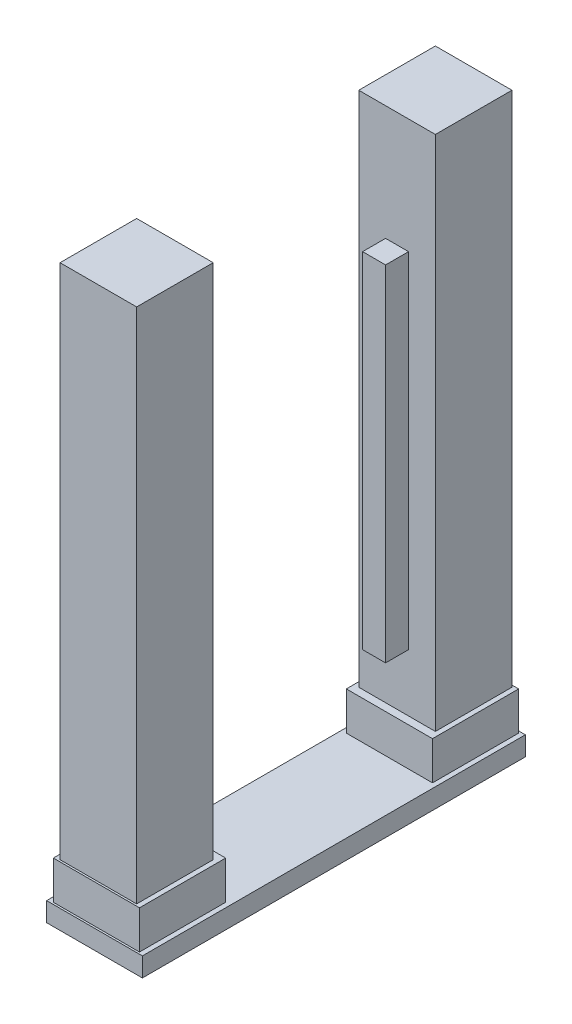
ISO-10303-21;
HEADER;
FILE_DESCRIPTION(('STEP AP214'),'2;1');
FILE_NAME('part.step','',(''),(''),'','','');
FILE_SCHEMA(('AUTOMOTIVE_DESIGN { 1 0 10303 214 1 1 1 1 }'));
ENDSEC;
DATA;
#1=APPLICATION_CONTEXT('core data for automotive mechanical design processes');
#2=APPLICATION_PROTOCOL_DEFINITION('international standard','automotive_design',2000,#1);
#3=PRODUCT_CONTEXT('',#1,'mechanical');
#4=PRODUCT('Part','Part','',(#3));
#5=PRODUCT_RELATED_PRODUCT_CATEGORY('part','',(#4));
#6=PRODUCT_DEFINITION_FORMATION('','',#4);
#7=PRODUCT_DEFINITION_CONTEXT('part definition',#1,'design');
#8=PRODUCT_DEFINITION('design','',#6,#7);
#9=PRODUCT_DEFINITION_SHAPE('','',#8);
#10=(LENGTH_UNIT() NAMED_UNIT(*) SI_UNIT(.MILLI.,.METRE.));
#11=(NAMED_UNIT(*) PLANE_ANGLE_UNIT() SI_UNIT($,.RADIAN.));
#12=(NAMED_UNIT(*) SI_UNIT($,.STERADIAN.) SOLID_ANGLE_UNIT());
#13=UNCERTAINTY_MEASURE_WITH_UNIT(LENGTH_MEASURE(1.E-05),#10,'distance_accuracy_value','');
#14=(GEOMETRIC_REPRESENTATION_CONTEXT(3) GLOBAL_UNCERTAINTY_ASSIGNED_CONTEXT((#13)) GLOBAL_UNIT_ASSIGNED_CONTEXT((#10,
#11,#12)) REPRESENTATION_CONTEXT('',''));
#15=CARTESIAN_POINT('',(0.,0.,0.));
#16=DIRECTION('',(0.,0.,1.));
#17=DIRECTION('',(1.,0.,0.));
#18=AXIS2_PLACEMENT_3D('',#15,#16,#17);
#19=CARTESIAN_POINT('',(-6.,13.0294372515229,58.));
#20=DIRECTION('',(0.,0.,1.));
#21=DIRECTION('',(1.,0.,0.));
#22=AXIS2_PLACEMENT_3D('',#19,#20,#21);
#23=PLANE('',#22);
#24=DIRECTION('',(-1.,0.,0.));
#25=VECTOR('',#24,1.);
#26=CARTESIAN_POINT('',(-6.,60.,58.));
#27=LINE('',#26,#25);
#28=CARTESIAN_POINT('',(6.,60.,58.));
#29=VERTEX_POINT('',#28);
#30=CARTESIAN_POINT('',(-6.,60.,58.));
#31=VERTEX_POINT('',#30);
#32=EDGE_CURVE('E57',#29,#31,#27,.T.);
#33=ORIENTED_EDGE('',*,*,#32,.F.);
#34=DIRECTION('',(0.,1.,0.));
#35=VECTOR('',#34,1.);
#36=CARTESIAN_POINT('',(6.,13.0294372515229,58.));
#37=LINE('',#36,#35);
#38=CARTESIAN_POINT('',(6.,240.,58.));
#39=VERTEX_POINT('',#38);
#40=EDGE_CURVE('E85',#29,#39,#37,.T.);
#41=ORIENTED_EDGE('',*,*,#40,.T.);
#42=DIRECTION('',(1.,0.,0.));
#43=VECTOR('',#42,1.);
#44=CARTESIAN_POINT('',(-6.,240.,58.));
#45=LINE('',#44,#43);
#46=CARTESIAN_POINT('',(-6.,240.,58.));
#47=VERTEX_POINT('',#46);
#48=EDGE_CURVE('E89',#47,#39,#45,.T.);
#49=ORIENTED_EDGE('',*,*,#48,.F.);
#50=DIRECTION('',(0.,1.,0.));
#51=VECTOR('',#50,1.);
#52=CARTESIAN_POINT('',(-6.,13.0294372515229,58.));
#53=LINE('',#52,#51);
#54=EDGE_CURVE('E112',#31,#47,#53,.T.);
#55=ORIENTED_EDGE('',*,*,#54,.F.);
#56=EDGE_LOOP('',(#33,#41,#49,#55));
#57=FACE_BOUND('',#56,.T.);
#58=ADVANCED_FACE('F49',(#57),#23,.T.);
#59=CARTESIAN_POINT('',(-6.,13.0294372515229,58.));
#60=DIRECTION('',(-1.,0.,0.));
#61=DIRECTION('',(0.,0.,1.));
#62=AXIS2_PLACEMENT_3D('',#59,#60,#61);
#63=PLANE('',#62);
#64=DIRECTION('',(0.,0.,-1.));
#65=VECTOR('',#64,1.);
#66=CARTESIAN_POINT('',(-6.,60.,58.));
#67=LINE('',#66,#65);
#68=CARTESIAN_POINT('',(-6.,60.,46.));
#69=VERTEX_POINT('',#68);
#70=EDGE_CURVE('E63',#31,#69,#67,.T.);
#71=ORIENTED_EDGE('',*,*,#70,.F.);
#72=ORIENTED_EDGE('',*,*,#54,.T.);
#73=DIRECTION('',(0.,0.,1.));
#74=VECTOR('',#73,1.);
#75=CARTESIAN_POINT('',(-6.,240.,58.));
#76=LINE('',#75,#74);
#77=CARTESIAN_POINT('',(-6.,240.,46.));
#78=VERTEX_POINT('',#77);
#79=EDGE_CURVE('E94',#78,#47,#76,.T.);
#80=ORIENTED_EDGE('',*,*,#79,.F.);
#81=DIRECTION('',(0.,1.,0.));
#82=VECTOR('',#81,1.);
#83=CARTESIAN_POINT('',(-6.,13.0294372515229,46.));
#84=LINE('',#83,#82);
#85=EDGE_CURVE('E115',#69,#78,#84,.T.);
#86=ORIENTED_EDGE('',*,*,#85,.F.);
#87=EDGE_LOOP('',(#71,#72,#80,#86));
#88=FACE_BOUND('',#87,.T.);
#89=ADVANCED_FACE('F121',(#88),#63,.T.);
#90=CARTESIAN_POINT('',(-6.,13.0294372515229,46.));
#91=DIRECTION('',(0.,0.,-1.));
#92=DIRECTION('',(-1.,0.,0.));
#93=AXIS2_PLACEMENT_3D('',#90,#91,#92);
#94=PLANE('',#93);
#95=DIRECTION('',(1.,0.,0.));
#96=VECTOR('',#95,1.);
#97=CARTESIAN_POINT('',(-6.,60.,46.));
#98=LINE('',#97,#96);
#99=CARTESIAN_POINT('',(6.,60.,46.));
#100=VERTEX_POINT('',#99);
#101=EDGE_CURVE('E114',#69,#100,#98,.T.);
#102=ORIENTED_EDGE('',*,*,#101,.F.);
#103=ORIENTED_EDGE('',*,*,#85,.T.);
#104=DIRECTION('',(-1.,0.,0.));
#105=VECTOR('',#104,1.);
#106=CARTESIAN_POINT('',(-6.,240.,46.));
#107=LINE('',#106,#105);
#108=CARTESIAN_POINT('',(6.,240.,46.));
#109=VERTEX_POINT('',#108);
#110=EDGE_CURVE('E102',#109,#78,#107,.T.);
#111=ORIENTED_EDGE('',*,*,#110,.F.);
#112=DIRECTION('',(0.,1.,0.));
#113=VECTOR('',#112,1.);
#114=CARTESIAN_POINT('',(6.,13.0294372515229,46.));
#115=LINE('',#114,#113);
#116=EDGE_CURVE('E93',#100,#109,#115,.T.);
#117=ORIENTED_EDGE('',*,*,#116,.F.);
#118=EDGE_LOOP('',(#102,#103,#111,#117));
#119=FACE_BOUND('',#118,.T.);
#120=ADVANCED_FACE('F119',(#119),#94,.T.);
#121=CARTESIAN_POINT('',(6.,13.0294372515229,58.));
#122=DIRECTION('',(1.,0.,0.));
#123=DIRECTION('',(0.,0.,-1.));
#124=AXIS2_PLACEMENT_3D('',#121,#122,#123);
#125=PLANE('',#124);
#126=DIRECTION('',(0.,0.,1.));
#127=VECTOR('',#126,1.);
#128=CARTESIAN_POINT('',(6.,60.,58.));
#129=LINE('',#128,#127);
#130=EDGE_CURVE('E13',#100,#29,#129,.T.);
#131=ORIENTED_EDGE('',*,*,#130,.F.);
#132=ORIENTED_EDGE('',*,*,#116,.T.);
#133=DIRECTION('',(0.,0.,-1.));
#134=VECTOR('',#133,1.);
#135=CARTESIAN_POINT('',(6.,240.,58.));
#136=LINE('',#135,#134);
#137=EDGE_CURVE('E96',#39,#109,#136,.T.);
#138=ORIENTED_EDGE('',*,*,#137,.F.);
#139=ORIENTED_EDGE('',*,*,#40,.F.);
#140=EDGE_LOOP('',(#131,#132,#138,#139));
#141=FACE_BOUND('',#140,.T.);
#142=ADVANCED_FACE('F97',(#141),#125,.T.);
#143=CARTESIAN_POINT('',(0.,240.,0.));
#144=DIRECTION('',(0.,1.,0.));
#145=DIRECTION('',(0.,0.,1.));
#146=AXIS2_PLACEMENT_3D('',#143,#144,#145);
#147=PLANE('',#146);
#148=ORIENTED_EDGE('',*,*,#48,.T.);
#149=ORIENTED_EDGE('',*,*,#137,.T.);
#150=ORIENTED_EDGE('',*,*,#110,.T.);
#151=ORIENTED_EDGE('',*,*,#79,.T.);
#152=EDGE_LOOP('',(#148,#149,#150,#151));
#153=FACE_BOUND('',#152,.T.);
#154=ADVANCED_FACE('F104',(#153),#147,.T.);
#155=CARTESIAN_POINT('',(0.,60.,0.));
#156=DIRECTION('',(0.,1.,0.));
#157=DIRECTION('',(0.,0.,1.));
#158=AXIS2_PLACEMENT_3D('',#155,#156,#157);
#159=PLANE('',#158);
#160=ORIENTED_EDGE('',*,*,#32,.T.);
#161=ORIENTED_EDGE('',*,*,#70,.T.);
#162=ORIENTED_EDGE('',*,*,#101,.T.);
#163=ORIENTED_EDGE('',*,*,#130,.T.);
#164=EDGE_LOOP('',(#160,#161,#162,#163));
#165=FACE_BOUND('',#164,.T.);
#166=ADVANCED_FACE('F123',(#165),#159,.F.);
#167=CLOSED_SHELL('',(#58,#89,#120,#142,#154,#166));
#168=MANIFOLD_SOLID_BREP('B2',#167);
#169=CARTESIAN_POINT('',(-6.,13.0294372515229,-58.));
#170=DIRECTION('',(-1.,0.,0.));
#171=DIRECTION('',(0.,0.,1.));
#172=AXIS2_PLACEMENT_3D('',#169,#170,#171);
#173=PLANE('',#172);
#174=DIRECTION('',(0.,0.,-1.));
#175=VECTOR('',#174,1.);
#176=CARTESIAN_POINT('',(-6.,60.,-58.));
#177=LINE('',#176,#175);
#178=CARTESIAN_POINT('',(-6.,60.,-46.));
#179=VERTEX_POINT('',#178);
#180=CARTESIAN_POINT('',(-6.,60.,-58.));
#181=VERTEX_POINT('',#180);
#182=EDGE_CURVE('E191',#179,#181,#177,.T.);
#183=ORIENTED_EDGE('',*,*,#182,.F.);
#184=DIRECTION('',(0.,1.,0.));
#185=VECTOR('',#184,1.);
#186=CARTESIAN_POINT('',(-6.,13.0294372515229,-46.));
#187=LINE('',#186,#185);
#188=CARTESIAN_POINT('',(-6.,240.,-46.));
#189=VERTEX_POINT('',#188);
#190=EDGE_CURVE('E219',#179,#189,#187,.T.);
#191=ORIENTED_EDGE('',*,*,#190,.T.);
#192=DIRECTION('',(0.,0.,1.));
#193=VECTOR('',#192,1.);
#194=CARTESIAN_POINT('',(-6.,240.,-58.));
#195=LINE('',#194,#193);
#196=CARTESIAN_POINT('',(-6.,240.,-58.));
#197=VERTEX_POINT('',#196);
#198=EDGE_CURVE('E223',#197,#189,#195,.T.);
#199=ORIENTED_EDGE('',*,*,#198,.F.);
#200=DIRECTION('',(0.,1.,0.));
#201=VECTOR('',#200,1.);
#202=CARTESIAN_POINT('',(-6.,13.0294372515229,-58.));
#203=LINE('',#202,#201);
#204=EDGE_CURVE('E246',#181,#197,#203,.T.);
#205=ORIENTED_EDGE('',*,*,#204,.F.);
#206=EDGE_LOOP('',(#183,#191,#199,#205));
#207=FACE_BOUND('',#206,.T.);
#208=ADVANCED_FACE('F183',(#207),#173,.T.);
#209=CARTESIAN_POINT('',(-6.,13.0294372515229,-58.));
#210=DIRECTION('',(0.,0.,-1.));
#211=DIRECTION('',(-1.,0.,0.));
#212=AXIS2_PLACEMENT_3D('',#209,#210,#211);
#213=PLANE('',#212);
#214=DIRECTION('',(1.,0.,0.));
#215=VECTOR('',#214,1.);
#216=CARTESIAN_POINT('',(-6.,60.,-58.));
#217=LINE('',#216,#215);
#218=CARTESIAN_POINT('',(6.,60.,-58.));
#219=VERTEX_POINT('',#218);
#220=EDGE_CURVE('E197',#181,#219,#217,.T.);
#221=ORIENTED_EDGE('',*,*,#220,.F.);
#222=ORIENTED_EDGE('',*,*,#204,.T.);
#223=DIRECTION('',(-1.,0.,0.));
#224=VECTOR('',#223,1.);
#225=CARTESIAN_POINT('',(-6.,240.,-58.));
#226=LINE('',#225,#224);
#227=CARTESIAN_POINT('',(6.,240.,-58.));
#228=VERTEX_POINT('',#227);
#229=EDGE_CURVE('E228',#228,#197,#226,.T.);
#230=ORIENTED_EDGE('',*,*,#229,.F.);
#231=DIRECTION('',(0.,1.,0.));
#232=VECTOR('',#231,1.);
#233=CARTESIAN_POINT('',(6.,13.0294372515229,-58.));
#234=LINE('',#233,#232);
#235=EDGE_CURVE('E249',#219,#228,#234,.T.);
#236=ORIENTED_EDGE('',*,*,#235,.F.);
#237=EDGE_LOOP('',(#221,#222,#230,#236));
#238=FACE_BOUND('',#237,.T.);
#239=ADVANCED_FACE('F255',(#238),#213,.T.);
#240=CARTESIAN_POINT('',(6.,13.0294372515229,-58.));
#241=DIRECTION('',(1.,0.,0.));
#242=DIRECTION('',(0.,0.,-1.));
#243=AXIS2_PLACEMENT_3D('',#240,#241,#242);
#244=PLANE('',#243);
#245=DIRECTION('',(0.,0.,1.));
#246=VECTOR('',#245,1.);
#247=CARTESIAN_POINT('',(6.,60.,-58.));
#248=LINE('',#247,#246);
#249=CARTESIAN_POINT('',(6.,60.,-46.));
#250=VERTEX_POINT('',#249);
#251=EDGE_CURVE('E248',#219,#250,#248,.T.);
#252=ORIENTED_EDGE('',*,*,#251,.F.);
#253=ORIENTED_EDGE('',*,*,#235,.T.);
#254=DIRECTION('',(0.,0.,-1.));
#255=VECTOR('',#254,1.);
#256=CARTESIAN_POINT('',(6.,240.,-58.));
#257=LINE('',#256,#255);
#258=CARTESIAN_POINT('',(6.,240.,-46.));
#259=VERTEX_POINT('',#258);
#260=EDGE_CURVE('E236',#259,#228,#257,.T.);
#261=ORIENTED_EDGE('',*,*,#260,.F.);
#262=DIRECTION('',(0.,1.,0.));
#263=VECTOR('',#262,1.);
#264=CARTESIAN_POINT('',(6.,13.0294372515229,-46.));
#265=LINE('',#264,#263);
#266=EDGE_CURVE('E227',#250,#259,#265,.T.);
#267=ORIENTED_EDGE('',*,*,#266,.F.);
#268=EDGE_LOOP('',(#252,#253,#261,#267));
#269=FACE_BOUND('',#268,.T.);
#270=ADVANCED_FACE('F253',(#269),#244,.T.);
#271=CARTESIAN_POINT('',(-6.,13.0294372515229,-46.));
#272=DIRECTION('',(0.,0.,1.));
#273=DIRECTION('',(1.,0.,0.));
#274=AXIS2_PLACEMENT_3D('',#271,#272,#273);
#275=PLANE('',#274);
#276=DIRECTION('',(-1.,0.,0.));
#277=VECTOR('',#276,1.);
#278=CARTESIAN_POINT('',(-6.,60.,-46.));
#279=LINE('',#278,#277);
#280=EDGE_CURVE('E47',#250,#179,#279,.T.);
#281=ORIENTED_EDGE('',*,*,#280,.F.);
#282=ORIENTED_EDGE('',*,*,#266,.T.);
#283=DIRECTION('',(1.,0.,0.));
#284=VECTOR('',#283,1.);
#285=CARTESIAN_POINT('',(-6.,240.,-46.));
#286=LINE('',#285,#284);
#287=EDGE_CURVE('E230',#189,#259,#286,.T.);
#288=ORIENTED_EDGE('',*,*,#287,.F.);
#289=ORIENTED_EDGE('',*,*,#190,.F.);
#290=EDGE_LOOP('',(#281,#282,#288,#289));
#291=FACE_BOUND('',#290,.T.);
#292=ADVANCED_FACE('F231',(#291),#275,.T.);
#293=CARTESIAN_POINT('',(0.,240.,0.));
#294=DIRECTION('',(0.,1.,0.));
#295=DIRECTION('',(0.,0.,1.));
#296=AXIS2_PLACEMENT_3D('',#293,#294,#295);
#297=PLANE('',#296);
#298=ORIENTED_EDGE('',*,*,#198,.T.);
#299=ORIENTED_EDGE('',*,*,#287,.T.);
#300=ORIENTED_EDGE('',*,*,#260,.T.);
#301=ORIENTED_EDGE('',*,*,#229,.T.);
#302=EDGE_LOOP('',(#298,#299,#300,#301));
#303=FACE_BOUND('',#302,.T.);
#304=ADVANCED_FACE('F238',(#303),#297,.T.);
#305=CARTESIAN_POINT('',(0.,60.,0.));
#306=DIRECTION('',(0.,1.,0.));
#307=DIRECTION('',(0.,0.,1.));
#308=AXIS2_PLACEMENT_3D('',#305,#306,#307);
#309=PLANE('',#308);
#310=ORIENTED_EDGE('',*,*,#182,.T.);
#311=ORIENTED_EDGE('',*,*,#220,.T.);
#312=ORIENTED_EDGE('',*,*,#251,.T.);
#313=ORIENTED_EDGE('',*,*,#280,.T.);
#314=EDGE_LOOP('',(#310,#311,#312,#313));
#315=FACE_BOUND('',#314,.T.);
#316=ADVANCED_FACE('F257',(#315),#309,.F.);
#317=CLOSED_SHELL('',(#208,#239,#270,#292,#304,#316));
#318=MANIFOLD_SOLID_BREP('B7',#317);
#319=CARTESIAN_POINT('',(-20.,300.,98.));
#320=DIRECTION('',(0.,0.,-1.));
#321=DIRECTION('',(-1.,0.,0.));
#322=AXIS2_PLACEMENT_3D('',#319,#320,#321);
#323=PLANE('',#322);
#324=DIRECTION('',(1.,0.,0.));
#325=VECTOR('',#324,1.);
#326=CARTESIAN_POINT('',(-20.,30.,98.));
#327=LINE('',#326,#325);
#328=CARTESIAN_POINT('',(-20.,30.,98.));
#329=VERTEX_POINT('',#328);
#330=CARTESIAN_POINT('',(20.,30.,98.));
#331=VERTEX_POINT('',#330);
#332=EDGE_CURVE('E380',#329,#331,#327,.T.);
#333=ORIENTED_EDGE('',*,*,#332,.T.);
#334=DIRECTION('',(0.,-1.,0.));
#335=VECTOR('',#334,1.);
#336=CARTESIAN_POINT('',(20.,300.,98.));
#337=LINE('',#336,#335);
#338=CARTESIAN_POINT('',(20.,300.,98.));
#339=VERTEX_POINT('',#338);
#340=EDGE_CURVE('E181',#339,#331,#337,.T.);
#341=ORIENTED_EDGE('',*,*,#340,.F.);
#342=DIRECTION('',(1.,0.,0.));
#343=VECTOR('',#342,1.);
#344=CARTESIAN_POINT('',(-20.,300.,98.));
#345=LINE('',#344,#343);
#346=CARTESIAN_POINT('',(-20.,300.,98.));
#347=VERTEX_POINT('',#346);
#348=EDGE_CURVE('E368',#347,#339,#345,.T.);
#349=ORIENTED_EDGE('',*,*,#348,.F.);
#350=DIRECTION('',(0.,-1.,0.));
#351=VECTOR('',#350,1.);
#352=CARTESIAN_POINT('',(-20.,300.,98.));
#353=LINE('',#352,#351);
#354=EDGE_CURVE('E376',#347,#329,#353,.T.);
#355=ORIENTED_EDGE('',*,*,#354,.T.);
#356=EDGE_LOOP('',(#333,#341,#349,#355));
#357=FACE_BOUND('',#356,.T.);
#358=ADVANCED_FACE('F317',(#357),#323,.F.);
#359=CARTESIAN_POINT('',(20.,300.,98.));
#360=DIRECTION('',(-1.,0.,0.));
#361=DIRECTION('',(0.,0.,1.));
#362=AXIS2_PLACEMENT_3D('',#359,#360,#361);
#363=PLANE('',#362);
#364=DIRECTION('',(0.,0.,-1.));
#365=VECTOR('',#364,1.);
#366=CARTESIAN_POINT('',(20.,30.,98.));
#367=LINE('',#366,#365);
#368=CARTESIAN_POINT('',(20.,30.,58.));
#369=VERTEX_POINT('',#368);
#370=EDGE_CURVE('E372',#331,#369,#367,.T.);
#371=ORIENTED_EDGE('',*,*,#370,.T.);
#372=DIRECTION('',(0.,-1.,0.));
#373=VECTOR('',#372,1.);
#374=CARTESIAN_POINT('',(20.,300.,58.));
#375=LINE('',#374,#373);
#376=CARTESIAN_POINT('',(20.,300.,58.));
#377=VERTEX_POINT('',#376);
#378=EDGE_CURVE('E325',#377,#369,#375,.T.);
#379=ORIENTED_EDGE('',*,*,#378,.F.);
#380=DIRECTION('',(0.,0.,-1.));
#381=VECTOR('',#380,1.);
#382=CARTESIAN_POINT('',(20.,300.,98.));
#383=LINE('',#382,#381);
#384=EDGE_CURVE('E363',#339,#377,#383,.T.);
#385=ORIENTED_EDGE('',*,*,#384,.F.);
#386=ORIENTED_EDGE('',*,*,#340,.T.);
#387=EDGE_LOOP('',(#371,#379,#385,#386));
#388=FACE_BOUND('',#387,.T.);
#389=ADVANCED_FACE('F371',(#388),#363,.F.);
#390=CARTESIAN_POINT('',(-20.,300.,58.));
#391=DIRECTION('',(0.,0.,1.));
#392=DIRECTION('',(1.,0.,0.));
#393=AXIS2_PLACEMENT_3D('',#390,#391,#392);
#394=PLANE('',#393);
#395=DIRECTION('',(-1.,0.,0.));
#396=VECTOR('',#395,1.);
#397=CARTESIAN_POINT('',(-20.,30.,58.));
#398=LINE('',#397,#396);
#399=CARTESIAN_POINT('',(-20.,30.,58.));
#400=VERTEX_POINT('',#399);
#401=EDGE_CURVE('E350',#369,#400,#398,.T.);
#402=ORIENTED_EDGE('',*,*,#401,.T.);
#403=DIRECTION('',(0.,-1.,0.));
#404=VECTOR('',#403,1.);
#405=CARTESIAN_POINT('',(-20.,300.,58.));
#406=LINE('',#405,#404);
#407=CARTESIAN_POINT('',(-20.,300.,58.));
#408=VERTEX_POINT('',#407);
#409=EDGE_CURVE('E373',#408,#400,#406,.T.);
#410=ORIENTED_EDGE('',*,*,#409,.F.);
#411=DIRECTION('',(-1.,0.,0.));
#412=VECTOR('',#411,1.);
#413=CARTESIAN_POINT('',(-20.,300.,58.));
#414=LINE('',#413,#412);
#415=EDGE_CURVE('E366',#377,#408,#414,.T.);
#416=ORIENTED_EDGE('',*,*,#415,.F.);
#417=ORIENTED_EDGE('',*,*,#378,.T.);
#418=EDGE_LOOP('',(#402,#410,#416,#417));
#419=FACE_BOUND('',#418,.T.);
#420=ADVANCED_FACE('F374',(#419),#394,.F.);
#421=CARTESIAN_POINT('',(-20.,300.,98.));
#422=DIRECTION('',(1.,0.,0.));
#423=DIRECTION('',(0.,0.,-1.));
#424=AXIS2_PLACEMENT_3D('',#421,#422,#423);
#425=PLANE('',#424);
#426=DIRECTION('',(0.,0.,1.));
#427=VECTOR('',#426,1.);
#428=CARTESIAN_POINT('',(-20.,30.,98.));
#429=LINE('',#428,#427);
#430=EDGE_CURVE('E356',#400,#329,#429,.T.);
#431=ORIENTED_EDGE('',*,*,#430,.T.);
#432=ORIENTED_EDGE('',*,*,#354,.F.);
#433=DIRECTION('',(0.,0.,1.));
#434=VECTOR('',#433,1.);
#435=CARTESIAN_POINT('',(-20.,300.,98.));
#436=LINE('',#435,#434);
#437=EDGE_CURVE('E333',#408,#347,#436,.T.);
#438=ORIENTED_EDGE('',*,*,#437,.F.);
#439=ORIENTED_EDGE('',*,*,#409,.T.);
#440=EDGE_LOOP('',(#431,#432,#438,#439));
#441=FACE_BOUND('',#440,.T.);
#442=ADVANCED_FACE('F387',(#441),#425,.F.);
#443=CARTESIAN_POINT('',(0.,300.,0.));
#444=DIRECTION('',(0.,1.,0.));
#445=DIRECTION('',(0.,0.,1.));
#446=AXIS2_PLACEMENT_3D('',#443,#444,#445);
#447=PLANE('',#446);
#448=ORIENTED_EDGE('',*,*,#348,.T.);
#449=ORIENTED_EDGE('',*,*,#384,.T.);
#450=ORIENTED_EDGE('',*,*,#415,.T.);
#451=ORIENTED_EDGE('',*,*,#437,.T.);
#452=EDGE_LOOP('',(#448,#449,#450,#451));
#453=FACE_BOUND('',#452,.T.);
#454=ADVANCED_FACE('F364',(#453),#447,.T.);
#455=CARTESIAN_POINT('',(0.,30.,0.));
#456=DIRECTION('',(0.,1.,0.));
#457=DIRECTION('',(0.,0.,1.));
#458=AXIS2_PLACEMENT_3D('',#455,#456,#457);
#459=PLANE('',#458);
#460=ORIENTED_EDGE('',*,*,#332,.F.);
#461=ORIENTED_EDGE('',*,*,#430,.F.);
#462=ORIENTED_EDGE('',*,*,#401,.F.);
#463=ORIENTED_EDGE('',*,*,#370,.F.);
#464=EDGE_LOOP('',(#460,#461,#462,#463));
#465=FACE_BOUND('',#464,.T.);
#466=ADVANCED_FACE('F390',(#465),#459,.F.);
#467=CLOSED_SHELL('',(#358,#389,#420,#442,#454,#466));
#468=MANIFOLD_SOLID_BREP('B41',#467);
#469=CARTESIAN_POINT('',(-20.,300.,-98.));
#470=DIRECTION('',(1.,0.,0.));
#471=DIRECTION('',(0.,0.,-1.));
#472=AXIS2_PLACEMENT_3D('',#469,#470,#471);
#473=PLANE('',#472);
#474=DIRECTION('',(0.,0.,1.));
#475=VECTOR('',#474,1.);
#476=CARTESIAN_POINT('',(-20.,30.,-98.));
#477=LINE('',#476,#475);
#478=CARTESIAN_POINT('',(-20.,30.,-98.));
#479=VERTEX_POINT('',#478);
#480=CARTESIAN_POINT('',(-20.,30.,-58.));
#481=VERTEX_POINT('',#480);
#482=EDGE_CURVE('E514',#479,#481,#477,.T.);
#483=ORIENTED_EDGE('',*,*,#482,.T.);
#484=DIRECTION('',(0.,-1.,0.));
#485=VECTOR('',#484,1.);
#486=CARTESIAN_POINT('',(-20.,300.,-58.));
#487=LINE('',#486,#485);
#488=CARTESIAN_POINT('',(-20.,300.,-58.));
#489=VERTEX_POINT('',#488);
#490=EDGE_CURVE('E315',#489,#481,#487,.T.);
#491=ORIENTED_EDGE('',*,*,#490,.F.);
#492=DIRECTION('',(0.,0.,1.));
#493=VECTOR('',#492,1.);
#494=CARTESIAN_POINT('',(-20.,300.,-98.));
#495=LINE('',#494,#493);
#496=CARTESIAN_POINT('',(-20.,300.,-98.));
#497=VERTEX_POINT('',#496);
#498=EDGE_CURVE('E502',#497,#489,#495,.T.);
#499=ORIENTED_EDGE('',*,*,#498,.F.);
#500=DIRECTION('',(0.,-1.,0.));
#501=VECTOR('',#500,1.);
#502=CARTESIAN_POINT('',(-20.,300.,-98.));
#503=LINE('',#502,#501);
#504=EDGE_CURVE('E510',#497,#479,#503,.T.);
#505=ORIENTED_EDGE('',*,*,#504,.T.);
#506=EDGE_LOOP('',(#483,#491,#499,#505));
#507=FACE_BOUND('',#506,.T.);
#508=ADVANCED_FACE('F451',(#507),#473,.F.);
#509=CARTESIAN_POINT('',(-20.,300.,-58.));
#510=DIRECTION('',(0.,0.,-1.));
#511=DIRECTION('',(-1.,0.,0.));
#512=AXIS2_PLACEMENT_3D('',#509,#510,#511);
#513=PLANE('',#512);
#514=DIRECTION('',(1.,0.,0.));
#515=VECTOR('',#514,1.);
#516=CARTESIAN_POINT('',(-20.,30.,-58.));
#517=LINE('',#516,#515);
#518=CARTESIAN_POINT('',(20.,30.,-58.));
#519=VERTEX_POINT('',#518);
#520=EDGE_CURVE('E506',#481,#519,#517,.T.);
#521=ORIENTED_EDGE('',*,*,#520,.T.);
#522=DIRECTION('',(0.,-1.,0.));
#523=VECTOR('',#522,1.);
#524=CARTESIAN_POINT('',(20.,300.,-58.));
#525=LINE('',#524,#523);
#526=CARTESIAN_POINT('',(20.,300.,-58.));
#527=VERTEX_POINT('',#526);
#528=EDGE_CURVE('E459',#527,#519,#525,.T.);
#529=ORIENTED_EDGE('',*,*,#528,.F.);
#530=DIRECTION('',(1.,0.,0.));
#531=VECTOR('',#530,1.);
#532=CARTESIAN_POINT('',(-20.,300.,-58.));
#533=LINE('',#532,#531);
#534=EDGE_CURVE('E497',#489,#527,#533,.T.);
#535=ORIENTED_EDGE('',*,*,#534,.F.);
#536=ORIENTED_EDGE('',*,*,#490,.T.);
#537=EDGE_LOOP('',(#521,#529,#535,#536));
#538=FACE_BOUND('',#537,.T.);
#539=ADVANCED_FACE('F505',(#538),#513,.F.);
#540=CARTESIAN_POINT('',(20.,300.,-98.));
#541=DIRECTION('',(-1.,0.,0.));
#542=DIRECTION('',(0.,0.,1.));
#543=AXIS2_PLACEMENT_3D('',#540,#541,#542);
#544=PLANE('',#543);
#545=DIRECTION('',(0.,0.,-1.));
#546=VECTOR('',#545,1.);
#547=CARTESIAN_POINT('',(20.,30.,-98.));
#548=LINE('',#547,#546);
#549=CARTESIAN_POINT('',(20.,30.,-98.));
#550=VERTEX_POINT('',#549);
#551=EDGE_CURVE('E484',#519,#550,#548,.T.);
#552=ORIENTED_EDGE('',*,*,#551,.T.);
#553=DIRECTION('',(0.,-1.,0.));
#554=VECTOR('',#553,1.);
#555=CARTESIAN_POINT('',(20.,300.,-98.));
#556=LINE('',#555,#554);
#557=CARTESIAN_POINT('',(20.,300.,-98.));
#558=VERTEX_POINT('',#557);
#559=EDGE_CURVE('E507',#558,#550,#556,.T.);
#560=ORIENTED_EDGE('',*,*,#559,.F.);
#561=DIRECTION('',(0.,0.,-1.));
#562=VECTOR('',#561,1.);
#563=CARTESIAN_POINT('',(20.,300.,-98.));
#564=LINE('',#563,#562);
#565=EDGE_CURVE('E500',#527,#558,#564,.T.);
#566=ORIENTED_EDGE('',*,*,#565,.F.);
#567=ORIENTED_EDGE('',*,*,#528,.T.);
#568=EDGE_LOOP('',(#552,#560,#566,#567));
#569=FACE_BOUND('',#568,.T.);
#570=ADVANCED_FACE('F508',(#569),#544,.F.);
#571=CARTESIAN_POINT('',(-20.,300.,-98.));
#572=DIRECTION('',(0.,0.,1.));
#573=DIRECTION('',(1.,0.,0.));
#574=AXIS2_PLACEMENT_3D('',#571,#572,#573);
#575=PLANE('',#574);
#576=DIRECTION('',(-1.,0.,0.));
#577=VECTOR('',#576,1.);
#578=CARTESIAN_POINT('',(-20.,30.,-98.));
#579=LINE('',#578,#577);
#580=EDGE_CURVE('E490',#550,#479,#579,.T.);
#581=ORIENTED_EDGE('',*,*,#580,.T.);
#582=ORIENTED_EDGE('',*,*,#504,.F.);
#583=DIRECTION('',(-1.,0.,0.));
#584=VECTOR('',#583,1.);
#585=CARTESIAN_POINT('',(-20.,300.,-98.));
#586=LINE('',#585,#584);
#587=EDGE_CURVE('E467',#558,#497,#586,.T.);
#588=ORIENTED_EDGE('',*,*,#587,.F.);
#589=ORIENTED_EDGE('',*,*,#559,.T.);
#590=EDGE_LOOP('',(#581,#582,#588,#589));
#591=FACE_BOUND('',#590,.T.);
#592=ADVANCED_FACE('F521',(#591),#575,.F.);
#593=CARTESIAN_POINT('',(0.,300.,0.));
#594=DIRECTION('',(0.,1.,0.));
#595=DIRECTION('',(0.,0.,1.));
#596=AXIS2_PLACEMENT_3D('',#593,#594,#595);
#597=PLANE('',#596);
#598=ORIENTED_EDGE('',*,*,#498,.T.);
#599=ORIENTED_EDGE('',*,*,#534,.T.);
#600=ORIENTED_EDGE('',*,*,#565,.T.);
#601=ORIENTED_EDGE('',*,*,#587,.T.);
#602=EDGE_LOOP('',(#598,#599,#600,#601));
#603=FACE_BOUND('',#602,.T.);
#604=ADVANCED_FACE('F498',(#603),#597,.T.);
#605=CARTESIAN_POINT('',(0.,30.,0.));
#606=DIRECTION('',(0.,1.,0.));
#607=DIRECTION('',(0.,0.,1.));
#608=AXIS2_PLACEMENT_3D('',#605,#606,#607);
#609=PLANE('',#608);
#610=ORIENTED_EDGE('',*,*,#482,.F.);
#611=ORIENTED_EDGE('',*,*,#580,.F.);
#612=ORIENTED_EDGE('',*,*,#551,.F.);
#613=ORIENTED_EDGE('',*,*,#520,.F.);
#614=EDGE_LOOP('',(#610,#611,#612,#613));
#615=FACE_BOUND('',#614,.T.);
#616=ADVANCED_FACE('F524',(#615),#609,.F.);
#617=CLOSED_SHELL('',(#508,#539,#570,#592,#604,#616));
#618=MANIFOLD_SOLID_BREP('B175',#617);
#619=CARTESIAN_POINT('',(-22.5,30.,99.));
#620=DIRECTION('',(0.,0.,-1.));
#621=DIRECTION('',(-1.,0.,0.));
#622=AXIS2_PLACEMENT_3D('',#619,#620,#621);
#623=PLANE('',#622);
#624=DIRECTION('',(1.,0.,0.));
#625=VECTOR('',#624,1.);
#626=CARTESIAN_POINT('',(-22.5,10.,99.));
#627=LINE('',#626,#625);
#628=CARTESIAN_POINT('',(-22.5,10.,99.));
#629=VERTEX_POINT('',#628);
#630=CARTESIAN_POINT('',(22.5,10.,99.));
#631=VERTEX_POINT('',#630);
#632=EDGE_CURVE('E649',#629,#631,#627,.T.);
#633=ORIENTED_EDGE('',*,*,#632,.T.);
#634=DIRECTION('',(0.,-1.,0.));
#635=VECTOR('',#634,1.);
#636=CARTESIAN_POINT('',(22.5,30.,99.));
#637=LINE('',#636,#635);
#638=CARTESIAN_POINT('',(22.5,30.,99.));
#639=VERTEX_POINT('',#638);
#640=EDGE_CURVE('E449',#639,#631,#637,.T.);
#641=ORIENTED_EDGE('',*,*,#640,.F.);
#642=DIRECTION('',(1.,0.,0.));
#643=VECTOR('',#642,1.);
#644=CARTESIAN_POINT('',(-22.5,30.,99.));
#645=LINE('',#644,#643);
#646=CARTESIAN_POINT('',(-22.5,30.,99.));
#647=VERTEX_POINT('',#646);
#648=EDGE_CURVE('E637',#647,#639,#645,.T.);
#649=ORIENTED_EDGE('',*,*,#648,.F.);
#650=DIRECTION('',(0.,-1.,0.));
#651=VECTOR('',#650,1.);
#652=CARTESIAN_POINT('',(-22.5,30.,99.));
#653=LINE('',#652,#651);
#654=EDGE_CURVE('E645',#647,#629,#653,.T.);
#655=ORIENTED_EDGE('',*,*,#654,.T.);
#656=EDGE_LOOP('',(#633,#641,#649,#655));
#657=FACE_BOUND('',#656,.T.);
#658=ADVANCED_FACE('F586',(#657),#623,.F.);
#659=CARTESIAN_POINT('',(22.5,30.,99.));
#660=DIRECTION('',(-1.,0.,0.));
#661=DIRECTION('',(0.,0.,1.));
#662=AXIS2_PLACEMENT_3D('',#659,#660,#661);
#663=PLANE('',#662);
#664=DIRECTION('',(0.,0.,-1.));
#665=VECTOR('',#664,1.);
#666=CARTESIAN_POINT('',(22.5,10.,99.));
#667=LINE('',#666,#665);
#668=CARTESIAN_POINT('',(22.5,10.,54.));
#669=VERTEX_POINT('',#668);
#670=EDGE_CURVE('E641',#631,#669,#667,.T.);
#671=ORIENTED_EDGE('',*,*,#670,.T.);
#672=DIRECTION('',(0.,-1.,0.));
#673=VECTOR('',#672,1.);
#674=CARTESIAN_POINT('',(22.5,30.,54.));
#675=LINE('',#674,#673);
#676=CARTESIAN_POINT('',(22.5,30.,54.));
#677=VERTEX_POINT('',#676);
#678=EDGE_CURVE('E594',#677,#669,#675,.T.);
#679=ORIENTED_EDGE('',*,*,#678,.F.);
#680=DIRECTION('',(0.,0.,-1.));
#681=VECTOR('',#680,1.);
#682=CARTESIAN_POINT('',(22.5,30.,99.));
#683=LINE('',#682,#681);
#684=EDGE_CURVE('E632',#639,#677,#683,.T.);
#685=ORIENTED_EDGE('',*,*,#684,.F.);
#686=ORIENTED_EDGE('',*,*,#640,.T.);
#687=EDGE_LOOP('',(#671,#679,#685,#686));
#688=FACE_BOUND('',#687,.T.);
#689=ADVANCED_FACE('F640',(#688),#663,.F.);
#690=CARTESIAN_POINT('',(-22.5,30.,54.));
#691=DIRECTION('',(0.,0.,1.));
#692=DIRECTION('',(1.,0.,0.));
#693=AXIS2_PLACEMENT_3D('',#690,#691,#692);
#694=PLANE('',#693);
#695=DIRECTION('',(-1.,0.,0.));
#696=VECTOR('',#695,1.);
#697=CARTESIAN_POINT('',(-22.5,10.,54.));
#698=LINE('',#697,#696);
#699=CARTESIAN_POINT('',(-22.5,10.,54.));
#700=VERTEX_POINT('',#699);
#701=EDGE_CURVE('E619',#669,#700,#698,.T.);
#702=ORIENTED_EDGE('',*,*,#701,.T.);
#703=DIRECTION('',(0.,-1.,0.));
#704=VECTOR('',#703,1.);
#705=CARTESIAN_POINT('',(-22.5,30.,54.));
#706=LINE('',#705,#704);
#707=CARTESIAN_POINT('',(-22.5,30.,54.));
#708=VERTEX_POINT('',#707);
#709=EDGE_CURVE('E642',#708,#700,#706,.T.);
#710=ORIENTED_EDGE('',*,*,#709,.F.);
#711=DIRECTION('',(-1.,0.,0.));
#712=VECTOR('',#711,1.);
#713=CARTESIAN_POINT('',(-22.5,30.,54.));
#714=LINE('',#713,#712);
#715=EDGE_CURVE('E635',#677,#708,#714,.T.);
#716=ORIENTED_EDGE('',*,*,#715,.F.);
#717=ORIENTED_EDGE('',*,*,#678,.T.);
#718=EDGE_LOOP('',(#702,#710,#716,#717));
#719=FACE_BOUND('',#718,.T.);
#720=ADVANCED_FACE('F643',(#719),#694,.F.);
#721=CARTESIAN_POINT('',(-22.5,30.,99.));
#722=DIRECTION('',(1.,0.,0.));
#723=DIRECTION('',(0.,0.,-1.));
#724=AXIS2_PLACEMENT_3D('',#721,#722,#723);
#725=PLANE('',#724);
#726=DIRECTION('',(0.,0.,1.));
#727=VECTOR('',#726,1.);
#728=CARTESIAN_POINT('',(-22.5,10.,99.));
#729=LINE('',#728,#727);
#730=EDGE_CURVE('E625',#700,#629,#729,.T.);
#731=ORIENTED_EDGE('',*,*,#730,.T.);
#732=ORIENTED_EDGE('',*,*,#654,.F.);
#733=DIRECTION('',(0.,0.,1.));
#734=VECTOR('',#733,1.);
#735=CARTESIAN_POINT('',(-22.5,30.,99.));
#736=LINE('',#735,#734);
#737=EDGE_CURVE('E602',#708,#647,#736,.T.);
#738=ORIENTED_EDGE('',*,*,#737,.F.);
#739=ORIENTED_EDGE('',*,*,#709,.T.);
#740=EDGE_LOOP('',(#731,#732,#738,#739));
#741=FACE_BOUND('',#740,.T.);
#742=ADVANCED_FACE('F656',(#741),#725,.F.);
#743=CARTESIAN_POINT('',(0.,30.,0.));
#744=DIRECTION('',(0.,1.,0.));
#745=DIRECTION('',(0.,0.,1.));
#746=AXIS2_PLACEMENT_3D('',#743,#744,#745);
#747=PLANE('',#746);
#748=ORIENTED_EDGE('',*,*,#648,.T.);
#749=ORIENTED_EDGE('',*,*,#684,.T.);
#750=ORIENTED_EDGE('',*,*,#715,.T.);
#751=ORIENTED_EDGE('',*,*,#737,.T.);
#752=EDGE_LOOP('',(#748,#749,#750,#751));
#753=FACE_BOUND('',#752,.T.);
#754=ADVANCED_FACE('F633',(#753),#747,.T.);
#755=CARTESIAN_POINT('',(0.,10.,0.));
#756=DIRECTION('',(0.,1.,0.));
#757=DIRECTION('',(0.,0.,1.));
#758=AXIS2_PLACEMENT_3D('',#755,#756,#757);
#759=PLANE('',#758);
#760=ORIENTED_EDGE('',*,*,#632,.F.);
#761=ORIENTED_EDGE('',*,*,#730,.F.);
#762=ORIENTED_EDGE('',*,*,#701,.F.);
#763=ORIENTED_EDGE('',*,*,#670,.F.);
#764=EDGE_LOOP('',(#760,#761,#762,#763));
#765=FACE_BOUND('',#764,.T.);
#766=ADVANCED_FACE('F659',(#765),#759,.F.);
#767=CLOSED_SHELL('',(#658,#689,#720,#742,#754,#766));
#768=MANIFOLD_SOLID_BREP('B309',#767);
#769=CARTESIAN_POINT('',(-22.5,30.,-99.));
#770=DIRECTION('',(1.,0.,0.));
#771=DIRECTION('',(0.,0.,-1.));
#772=AXIS2_PLACEMENT_3D('',#769,#770,#771);
#773=PLANE('',#772);
#774=DIRECTION('',(0.,0.,1.));
#775=VECTOR('',#774,1.);
#776=CARTESIAN_POINT('',(-22.5,10.,-99.));
#777=LINE('',#776,#775);
#778=CARTESIAN_POINT('',(-22.5,10.,-99.));
#779=VERTEX_POINT('',#778);
#780=CARTESIAN_POINT('',(-22.5,10.,-54.));
#781=VERTEX_POINT('',#780);
#782=EDGE_CURVE('E783',#779,#781,#777,.T.);
#783=ORIENTED_EDGE('',*,*,#782,.T.);
#784=DIRECTION('',(0.,-1.,0.));
#785=VECTOR('',#784,1.);
#786=CARTESIAN_POINT('',(-22.5,30.,-54.));
#787=LINE('',#786,#785);
#788=CARTESIAN_POINT('',(-22.5,30.,-54.));
#789=VERTEX_POINT('',#788);
#790=EDGE_CURVE('E584',#789,#781,#787,.T.);
#791=ORIENTED_EDGE('',*,*,#790,.F.);
#792=DIRECTION('',(0.,0.,1.));
#793=VECTOR('',#792,1.);
#794=CARTESIAN_POINT('',(-22.5,30.,-99.));
#795=LINE('',#794,#793);
#796=CARTESIAN_POINT('',(-22.5,30.,-99.));
#797=VERTEX_POINT('',#796);
#798=EDGE_CURVE('E771',#797,#789,#795,.T.);
#799=ORIENTED_EDGE('',*,*,#798,.F.);
#800=DIRECTION('',(0.,-1.,0.));
#801=VECTOR('',#800,1.);
#802=CARTESIAN_POINT('',(-22.5,30.,-99.));
#803=LINE('',#802,#801);
#804=EDGE_CURVE('E779',#797,#779,#803,.T.);
#805=ORIENTED_EDGE('',*,*,#804,.T.);
#806=EDGE_LOOP('',(#783,#791,#799,#805));
#807=FACE_BOUND('',#806,.T.);
#808=ADVANCED_FACE('F720',(#807),#773,.F.);
#809=CARTESIAN_POINT('',(-22.5,30.,-54.));
#810=DIRECTION('',(0.,0.,-1.));
#811=DIRECTION('',(-1.,0.,0.));
#812=AXIS2_PLACEMENT_3D('',#809,#810,#811);
#813=PLANE('',#812);
#814=DIRECTION('',(1.,0.,0.));
#815=VECTOR('',#814,1.);
#816=CARTESIAN_POINT('',(-22.5,10.,-54.));
#817=LINE('',#816,#815);
#818=CARTESIAN_POINT('',(22.5,10.,-54.));
#819=VERTEX_POINT('',#818);
#820=EDGE_CURVE('E775',#781,#819,#817,.T.);
#821=ORIENTED_EDGE('',*,*,#820,.T.);
#822=DIRECTION('',(0.,-1.,0.));
#823=VECTOR('',#822,1.);
#824=CARTESIAN_POINT('',(22.5,30.,-54.));
#825=LINE('',#824,#823);
#826=CARTESIAN_POINT('',(22.5,30.,-54.));
#827=VERTEX_POINT('',#826);
#828=EDGE_CURVE('E728',#827,#819,#825,.T.);
#829=ORIENTED_EDGE('',*,*,#828,.F.);
#830=DIRECTION('',(1.,0.,0.));
#831=VECTOR('',#830,1.);
#832=CARTESIAN_POINT('',(-22.5,30.,-54.));
#833=LINE('',#832,#831);
#834=EDGE_CURVE('E766',#789,#827,#833,.T.);
#835=ORIENTED_EDGE('',*,*,#834,.F.);
#836=ORIENTED_EDGE('',*,*,#790,.T.);
#837=EDGE_LOOP('',(#821,#829,#835,#836));
#838=FACE_BOUND('',#837,.T.);
#839=ADVANCED_FACE('F774',(#838),#813,.F.);
#840=CARTESIAN_POINT('',(22.5,30.,-99.));
#841=DIRECTION('',(-1.,0.,0.));
#842=DIRECTION('',(0.,0.,1.));
#843=AXIS2_PLACEMENT_3D('',#840,#841,#842);
#844=PLANE('',#843);
#845=DIRECTION('',(0.,0.,-1.));
#846=VECTOR('',#845,1.);
#847=CARTESIAN_POINT('',(22.5,10.,-99.));
#848=LINE('',#847,#846);
#849=CARTESIAN_POINT('',(22.5,10.,-99.));
#850=VERTEX_POINT('',#849);
#851=EDGE_CURVE('E753',#819,#850,#848,.T.);
#852=ORIENTED_EDGE('',*,*,#851,.T.);
#853=DIRECTION('',(0.,-1.,0.));
#854=VECTOR('',#853,1.);
#855=CARTESIAN_POINT('',(22.5,30.,-99.));
#856=LINE('',#855,#854);
#857=CARTESIAN_POINT('',(22.5,30.,-99.));
#858=VERTEX_POINT('',#857);
#859=EDGE_CURVE('E776',#858,#850,#856,.T.);
#860=ORIENTED_EDGE('',*,*,#859,.F.);
#861=DIRECTION('',(0.,0.,-1.));
#862=VECTOR('',#861,1.);
#863=CARTESIAN_POINT('',(22.5,30.,-99.));
#864=LINE('',#863,#862);
#865=EDGE_CURVE('E769',#827,#858,#864,.T.);
#866=ORIENTED_EDGE('',*,*,#865,.F.);
#867=ORIENTED_EDGE('',*,*,#828,.T.);
#868=EDGE_LOOP('',(#852,#860,#866,#867));
#869=FACE_BOUND('',#868,.T.);
#870=ADVANCED_FACE('F777',(#869),#844,.F.);
#871=CARTESIAN_POINT('',(-22.5,30.,-99.));
#872=DIRECTION('',(0.,0.,1.));
#873=DIRECTION('',(1.,0.,0.));
#874=AXIS2_PLACEMENT_3D('',#871,#872,#873);
#875=PLANE('',#874);
#876=DIRECTION('',(-1.,0.,0.));
#877=VECTOR('',#876,1.);
#878=CARTESIAN_POINT('',(-22.5,10.,-99.));
#879=LINE('',#878,#877);
#880=EDGE_CURVE('E759',#850,#779,#879,.T.);
#881=ORIENTED_EDGE('',*,*,#880,.T.);
#882=ORIENTED_EDGE('',*,*,#804,.F.);
#883=DIRECTION('',(-1.,0.,0.));
#884=VECTOR('',#883,1.);
#885=CARTESIAN_POINT('',(-22.5,30.,-99.));
#886=LINE('',#885,#884);
#887=EDGE_CURVE('E736',#858,#797,#886,.T.);
#888=ORIENTED_EDGE('',*,*,#887,.F.);
#889=ORIENTED_EDGE('',*,*,#859,.T.);
#890=EDGE_LOOP('',(#881,#882,#888,#889));
#891=FACE_BOUND('',#890,.T.);
#892=ADVANCED_FACE('F790',(#891),#875,.F.);
#893=CARTESIAN_POINT('',(0.,30.,0.));
#894=DIRECTION('',(0.,1.,0.));
#895=DIRECTION('',(0.,0.,1.));
#896=AXIS2_PLACEMENT_3D('',#893,#894,#895);
#897=PLANE('',#896);
#898=ORIENTED_EDGE('',*,*,#798,.T.);
#899=ORIENTED_EDGE('',*,*,#834,.T.);
#900=ORIENTED_EDGE('',*,*,#865,.T.);
#901=ORIENTED_EDGE('',*,*,#887,.T.);
#902=EDGE_LOOP('',(#898,#899,#900,#901));
#903=FACE_BOUND('',#902,.T.);
#904=ADVANCED_FACE('F767',(#903),#897,.T.);
#905=CARTESIAN_POINT('',(0.,10.,0.));
#906=DIRECTION('',(0.,1.,0.));
#907=DIRECTION('',(0.,0.,1.));
#908=AXIS2_PLACEMENT_3D('',#905,#906,#907);
#909=PLANE('',#908);
#910=ORIENTED_EDGE('',*,*,#782,.F.);
#911=ORIENTED_EDGE('',*,*,#880,.F.);
#912=ORIENTED_EDGE('',*,*,#851,.F.);
#913=ORIENTED_EDGE('',*,*,#820,.F.);
#914=EDGE_LOOP('',(#910,#911,#912,#913));
#915=FACE_BOUND('',#914,.T.);
#916=ADVANCED_FACE('F793',(#915),#909,.F.);
#917=CLOSED_SHELL('',(#808,#839,#870,#892,#904,#916));
#918=MANIFOLD_SOLID_BREP('B443',#917);
#919=CARTESIAN_POINT('',(25.,10.,100.));
#920=DIRECTION('',(-1.,0.,0.));
#921=DIRECTION('',(0.,0.,1.));
#922=AXIS2_PLACEMENT_3D('',#919,#920,#921);
#923=PLANE('',#922);
#924=DIRECTION('',(0.,0.,-1.));
#925=VECTOR('',#924,1.);
#926=CARTESIAN_POINT('',(25.,0.,100.));
#927=LINE('',#926,#925);
#928=CARTESIAN_POINT('',(25.,0.,100.));
#929=VERTEX_POINT('',#928);
#930=CARTESIAN_POINT('',(25.,0.,-100.));
#931=VERTEX_POINT('',#930);
#932=EDGE_CURVE('E907',#929,#931,#927,.T.);
#933=ORIENTED_EDGE('',*,*,#932,.T.);
#934=DIRECTION('',(0.,-1.,0.));
#935=VECTOR('',#934,1.);
#936=CARTESIAN_POINT('',(25.,10.,-100.));
#937=LINE('',#936,#935);
#938=CARTESIAN_POINT('',(25.,10.,-100.));
#939=VERTEX_POINT('',#938);
#940=EDGE_CURVE('E718',#939,#931,#937,.T.);
#941=ORIENTED_EDGE('',*,*,#940,.F.);
#942=DIRECTION('',(0.,0.,-1.));
#943=VECTOR('',#942,1.);
#944=CARTESIAN_POINT('',(25.,10.,100.));
#945=LINE('',#944,#943);
#946=CARTESIAN_POINT('',(25.,10.,100.));
#947=VERTEX_POINT('',#946);
#948=EDGE_CURVE('E895',#947,#939,#945,.T.);
#949=ORIENTED_EDGE('',*,*,#948,.F.);
#950=DIRECTION('',(0.,-1.,0.));
#951=VECTOR('',#950,1.);
#952=CARTESIAN_POINT('',(25.,10.,100.));
#953=LINE('',#952,#951);
#954=EDGE_CURVE('E903',#947,#929,#953,.T.);
#955=ORIENTED_EDGE('',*,*,#954,.T.);
#956=EDGE_LOOP('',(#933,#941,#949,#955));
#957=FACE_BOUND('',#956,.T.);
#958=ADVANCED_FACE('F844',(#957),#923,.F.);
#959=CARTESIAN_POINT('',(-25.,10.,-100.));
#960=DIRECTION('',(0.,0.,1.));
#961=DIRECTION('',(1.,0.,0.));
#962=AXIS2_PLACEMENT_3D('',#959,#960,#961);
#963=PLANE('',#962);
#964=DIRECTION('',(-1.,0.,0.));
#965=VECTOR('',#964,1.);
#966=CARTESIAN_POINT('',(-25.,0.,-100.));
#967=LINE('',#966,#965);
#968=CARTESIAN_POINT('',(-25.,0.,-100.));
#969=VERTEX_POINT('',#968);
#970=EDGE_CURVE('E899',#931,#969,#967,.T.);
#971=ORIENTED_EDGE('',*,*,#970,.T.);
#972=DIRECTION('',(0.,-1.,0.));
#973=VECTOR('',#972,1.);
#974=CARTESIAN_POINT('',(-25.,10.,-100.));
#975=LINE('',#974,#973);
#976=CARTESIAN_POINT('',(-25.,10.,-100.));
#977=VERTEX_POINT('',#976);
#978=EDGE_CURVE('E852',#977,#969,#975,.T.);
#979=ORIENTED_EDGE('',*,*,#978,.F.);
#980=DIRECTION('',(-1.,0.,0.));
#981=VECTOR('',#980,1.);
#982=CARTESIAN_POINT('',(-25.,10.,-100.));
#983=LINE('',#982,#981);
#984=EDGE_CURVE('E890',#939,#977,#983,.T.);
#985=ORIENTED_EDGE('',*,*,#984,.F.);
#986=ORIENTED_EDGE('',*,*,#940,.T.);
#987=EDGE_LOOP('',(#971,#979,#985,#986));
#988=FACE_BOUND('',#987,.T.);
#989=ADVANCED_FACE('F898',(#988),#963,.F.);
#990=CARTESIAN_POINT('',(-25.,10.,100.));
#991=DIRECTION('',(1.,0.,0.));
#992=DIRECTION('',(0.,0.,-1.));
#993=AXIS2_PLACEMENT_3D('',#990,#991,#992);
#994=PLANE('',#993);
#995=DIRECTION('',(0.,0.,1.));
#996=VECTOR('',#995,1.);
#997=CARTESIAN_POINT('',(-25.,0.,100.));
#998=LINE('',#997,#996);
#999=CARTESIAN_POINT('',(-25.,0.,100.));
#1000=VERTEX_POINT('',#999);
#1001=EDGE_CURVE('E877',#969,#1000,#998,.T.);
#1002=ORIENTED_EDGE('',*,*,#1001,.T.);
#1003=DIRECTION('',(0.,-1.,0.));
#1004=VECTOR('',#1003,1.);
#1005=CARTESIAN_POINT('',(-25.,10.,100.));
#1006=LINE('',#1005,#1004);
#1007=CARTESIAN_POINT('',(-25.,10.,100.));
#1008=VERTEX_POINT('',#1007);
#1009=EDGE_CURVE('E900',#1008,#1000,#1006,.T.);
#1010=ORIENTED_EDGE('',*,*,#1009,.F.);
#1011=DIRECTION('',(0.,0.,1.));
#1012=VECTOR('',#1011,1.);
#1013=CARTESIAN_POINT('',(-25.,10.,100.));
#1014=LINE('',#1013,#1012);
#1015=EDGE_CURVE('E893',#977,#1008,#1014,.T.);
#1016=ORIENTED_EDGE('',*,*,#1015,.F.);
#1017=ORIENTED_EDGE('',*,*,#978,.T.);
#1018=EDGE_LOOP('',(#1002,#1010,#1016,#1017));
#1019=FACE_BOUND('',#1018,.T.);
#1020=ADVANCED_FACE('F901',(#1019),#994,.F.);
#1021=CARTESIAN_POINT('',(-25.,10.,100.));
#1022=DIRECTION('',(0.,0.,-1.));
#1023=DIRECTION('',(-1.,0.,0.));
#1024=AXIS2_PLACEMENT_3D('',#1021,#1022,#1023);
#1025=PLANE('',#1024);
#1026=DIRECTION('',(1.,0.,0.));
#1027=VECTOR('',#1026,1.);
#1028=CARTESIAN_POINT('',(-25.,0.,100.));
#1029=LINE('',#1028,#1027);
#1030=EDGE_CURVE('E883',#1000,#929,#1029,.T.);
#1031=ORIENTED_EDGE('',*,*,#1030,.T.);
#1032=ORIENTED_EDGE('',*,*,#954,.F.);
#1033=DIRECTION('',(1.,0.,0.));
#1034=VECTOR('',#1033,1.);
#1035=CARTESIAN_POINT('',(-25.,10.,100.));
#1036=LINE('',#1035,#1034);
#1037=EDGE_CURVE('E860',#1008,#947,#1036,.T.);
#1038=ORIENTED_EDGE('',*,*,#1037,.F.);
#1039=ORIENTED_EDGE('',*,*,#1009,.T.);
#1040=EDGE_LOOP('',(#1031,#1032,#1038,#1039));
#1041=FACE_BOUND('',#1040,.T.);
#1042=ADVANCED_FACE('F914',(#1041),#1025,.F.);
#1043=CARTESIAN_POINT('',(0.,10.,0.));
#1044=DIRECTION('',(0.,-1.,0.));
#1045=DIRECTION('',(0.,0.,-1.));
#1046=AXIS2_PLACEMENT_3D('',#1043,#1044,#1045);
#1047=PLANE('',#1046);
#1048=ORIENTED_EDGE('',*,*,#948,.T.);
#1049=ORIENTED_EDGE('',*,*,#984,.T.);
#1050=ORIENTED_EDGE('',*,*,#1015,.T.);
#1051=ORIENTED_EDGE('',*,*,#1037,.T.);
#1052=EDGE_LOOP('',(#1048,#1049,#1050,#1051));
#1053=FACE_BOUND('',#1052,.T.);
#1054=ADVANCED_FACE('F891',(#1053),#1047,.F.);
#1055=CARTESIAN_POINT('',(0.,0.,0.));
#1056=DIRECTION('',(0.,-1.,0.));
#1057=DIRECTION('',(0.,0.,-1.));
#1058=AXIS2_PLACEMENT_3D('',#1055,#1056,#1057);
#1059=PLANE('',#1058);
#1060=ORIENTED_EDGE('',*,*,#932,.F.);
#1061=ORIENTED_EDGE('',*,*,#1030,.F.);
#1062=ORIENTED_EDGE('',*,*,#1001,.F.);
#1063=ORIENTED_EDGE('',*,*,#970,.F.);
#1064=EDGE_LOOP('',(#1060,#1061,#1062,#1063));
#1065=FACE_BOUND('',#1064,.T.);
#1066=ADVANCED_FACE('F917',(#1065),#1059,.T.);
#1067=CLOSED_SHELL('',(#958,#989,#1020,#1042,#1054,#1066));
#1068=MANIFOLD_SOLID_BREP('B578',#1067);
#1069=ADVANCED_BREP_SHAPE_REPRESENTATION('',(#18,#168,#318,#468,#618,#768,#918,#1068),#14);
#1070=SHAPE_DEFINITION_REPRESENTATION(#9,#1069);
ENDSEC;
END-ISO-10303-21;
